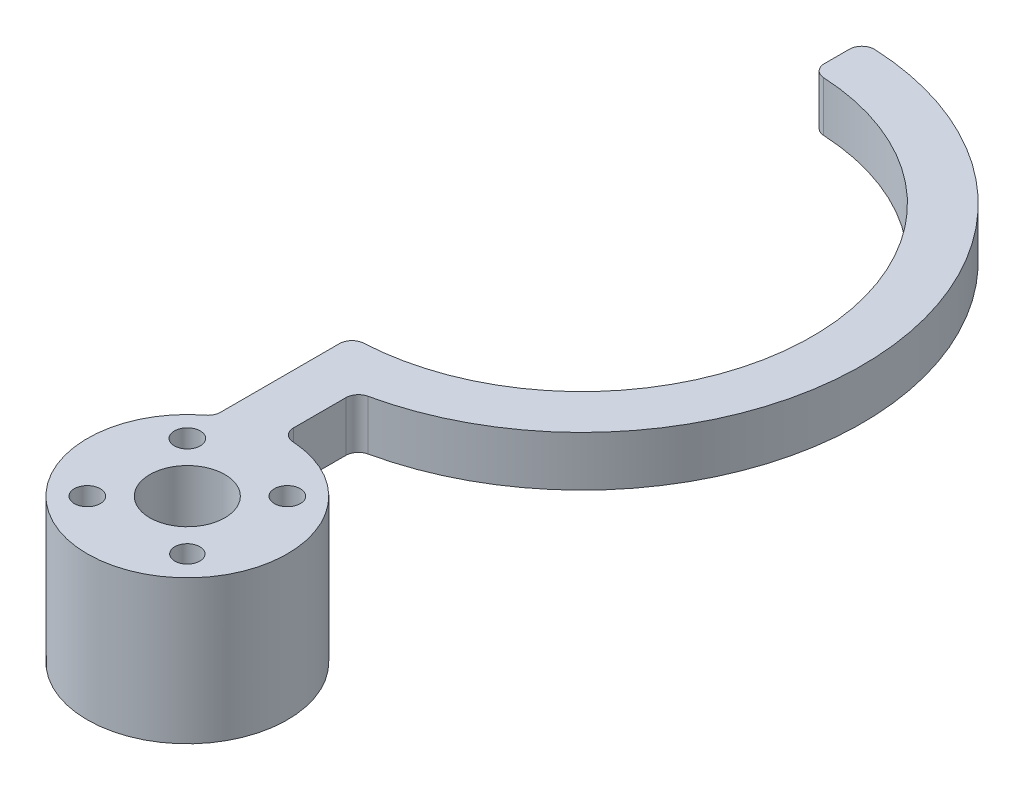
ISO-10303-21;
HEADER;
FILE_DESCRIPTION(('STEP AP214'),'2;1');
FILE_NAME('part.step','',(''),(''),'','','');
FILE_SCHEMA(('AUTOMOTIVE_DESIGN { 1 0 10303 214 1 1 1 1 }'));
ENDSEC;
DATA;
#1=APPLICATION_CONTEXT('core data for automotive mechanical design processes');
#2=APPLICATION_PROTOCOL_DEFINITION('international standard','automotive_design',2000,#1);
#3=PRODUCT_CONTEXT('',#1,'mechanical');
#4=PRODUCT('Part','Part','',(#3));
#5=PRODUCT_RELATED_PRODUCT_CATEGORY('part','',(#4));
#6=PRODUCT_DEFINITION_FORMATION('','',#4);
#7=PRODUCT_DEFINITION_CONTEXT('part definition',#1,'design');
#8=PRODUCT_DEFINITION('design','',#6,#7);
#9=PRODUCT_DEFINITION_SHAPE('','',#8);
#10=(LENGTH_UNIT() NAMED_UNIT(*) SI_UNIT(.MILLI.,.METRE.));
#11=(NAMED_UNIT(*) PLANE_ANGLE_UNIT() SI_UNIT($,.RADIAN.));
#12=(NAMED_UNIT(*) SI_UNIT($,.STERADIAN.) SOLID_ANGLE_UNIT());
#13=UNCERTAINTY_MEASURE_WITH_UNIT(LENGTH_MEASURE(1.E-05),#10,'distance_accuracy_value','');
#14=(GEOMETRIC_REPRESENTATION_CONTEXT(3) GLOBAL_UNCERTAINTY_ASSIGNED_CONTEXT((#13)) GLOBAL_UNIT_ASSIGNED_CONTEXT((#10,
#11,#12)) REPRESENTATION_CONTEXT('',''));
#15=CARTESIAN_POINT('',(0.,0.,0.));
#16=DIRECTION('',(0.,0.,1.));
#17=DIRECTION('',(1.,0.,0.));
#18=AXIS2_PLACEMENT_3D('',#15,#16,#17);
#19=CARTESIAN_POINT('',(8.96696536966746,8.,72.0811709693591));
#20=DIRECTION('',(0.,-1.,0.));
#21=DIRECTION('',(0.,0.,-1.));
#22=AXIS2_PLACEMENT_3D('',#19,#20,#21);
#23=CYLINDRICAL_SURFACE('',#22,16.);
#24=DIRECTION('',(0.,-1.,0.));
#25=VECTOR('',#24,1.);
#26=CARTESIAN_POINT('',(-0.781448292259167,8.,59.3938374797734));
#27=LINE('',#26,#25);
#28=CARTESIAN_POINT('',(-0.781448292259167,8.,59.3938374797734));
#29=VERTEX_POINT('',#28);
#30=CARTESIAN_POINT('',(-0.781448292259168,0.,59.3938374797734));
#31=VERTEX_POINT('',#30);
#32=EDGE_CURVE('E144',#29,#31,#27,.T.);
#33=ORIENTED_EDGE('',*,*,#32,.T.);
#34=CARTESIAN_POINT('',(8.96696536966746,0.,72.0811709693591));
#35=DIRECTION('',(0.,1.,0.));
#36=DIRECTION('',(0.,0.,1.));
#37=AXIS2_PLACEMENT_3D('',#34,#35,#36);
#38=CIRCLE('',#37,16.);
#39=CARTESIAN_POINT('',(9.8852183744075,0.,56.1075423453023));
#40=VERTEX_POINT('',#39);
#41=EDGE_CURVE('E126',#40,#31,#38,.T.);
#42=ORIENTED_EDGE('',*,*,#41,.F.);
#43=DIRECTION('',(0.,-1.,0.));
#44=VECTOR('',#43,1.);
#45=CARTESIAN_POINT('',(9.8852183744075,8.,56.1075423453023));
#46=LINE('',#45,#44);
#47=CARTESIAN_POINT('',(9.8852183744075,8.,56.1075423453023));
#48=VERTEX_POINT('',#47);
#49=EDGE_CURVE('E151',#40,#48,#46,.F.);
#50=ORIENTED_EDGE('',*,*,#49,.T.);
#51=CARTESIAN_POINT('',(8.96696536966746,8.,72.0811709693591));
#52=DIRECTION('',(0.,1.,0.));
#53=DIRECTION('',(0.,0.,1.));
#54=AXIS2_PLACEMENT_3D('',#51,#52,#53);
#55=CIRCLE('',#54,16.);
#56=EDGE_CURVE('E150',#29,#48,#55,.T.);
#57=ORIENTED_EDGE('',*,*,#56,.F.);
#58=EDGE_LOOP('',(#33,#42,#50,#57));
#59=FACE_BOUND('',#58,.T.);
#60=CARTESIAN_POINT('',(8.96696536966746,-15.,72.0811709693591));
#61=DIRECTION('',(0.,1.,0.));
#62=DIRECTION('',(0.,0.,1.));
#63=AXIS2_PLACEMENT_3D('',#60,#61,#62);
#64=CIRCLE('',#63,16.);
#65=CARTESIAN_POINT('',(8.96696536966746,-15.,88.0811709693591));
#66=VERTEX_POINT('',#65);
#67=EDGE_CURVE('E137',#66,#66,#64,.T.);
#68=ORIENTED_EDGE('',*,*,#67,.T.);
#69=EDGE_LOOP('',(#68));
#70=FACE_BOUND('',#69,.T.);
#71=ADVANCED_FACE('F37',(#59,#70),#23,.T.);
#72=CARTESIAN_POINT('',(8.00000000000002,8.,0.));
#73=DIRECTION('',(1.,0.,0.));
#74=DIRECTION('',(0.,0.,-1.));
#75=AXIS2_PLACEMENT_3D('',#72,#73,#74);
#76=PLANE('',#75);
#77=DIRECTION('',(0.,0.,1.));
#78=VECTOR('',#77,1.);
#79=CARTESIAN_POINT('',(8.00000000000002,8.,0.));
#80=LINE('',#79,#78);
#81=CARTESIAN_POINT('',(8.,8.,45.7498513658788));
#82=VERTEX_POINT('',#81);
#83=CARTESIAN_POINT('',(8.,8.,54.1108387672952));
#84=VERTEX_POINT('',#83);
#85=EDGE_CURVE('E201',#82,#84,#80,.T.);
#86=ORIENTED_EDGE('',*,*,#85,.T.);
#87=DIRECTION('',(0.,-1.,0.));
#88=VECTOR('',#87,1.);
#89=CARTESIAN_POINT('',(8.,8.,54.1108387672952));
#90=LINE('',#89,#88);
#91=CARTESIAN_POINT('',(8.,0.,54.1108387672952));
#92=VERTEX_POINT('',#91);
#93=EDGE_CURVE('E152',#84,#92,#90,.T.);
#94=ORIENTED_EDGE('',*,*,#93,.T.);
#95=DIRECTION('',(0.,0.,1.));
#96=VECTOR('',#95,1.);
#97=CARTESIAN_POINT('',(8.00000000000002,0.,0.));
#98=LINE('',#97,#96);
#99=CARTESIAN_POINT('',(8.,0.,45.7498513658788));
#100=VERTEX_POINT('',#99);
#101=EDGE_CURVE('E136',#100,#92,#98,.T.);
#102=ORIENTED_EDGE('',*,*,#101,.F.);
#103=DIRECTION('',(0.,-1.,0.));
#104=VECTOR('',#103,1.);
#105=CARTESIAN_POINT('',(8.,8.,45.7498513658788));
#106=LINE('',#105,#104);
#107=EDGE_CURVE('E157',#100,#82,#106,.F.);
#108=ORIENTED_EDGE('',*,*,#107,.T.);
#109=EDGE_LOOP('',(#86,#94,#102,#108));
#110=FACE_BOUND('',#109,.T.);
#111=ADVANCED_FACE('F216',(#110),#76,.T.);
#112=CARTESIAN_POINT('',(0.,8.,0.));
#113=DIRECTION('',(0.,-1.,0.));
#114=DIRECTION('',(0.,0.,-1.));
#115=AXIS2_PLACEMENT_3D('',#112,#113,#114);
#116=CYLINDRICAL_SURFACE('',#115,44.83);
#117=CARTESIAN_POINT('',(0.,8.,0.));
#118=DIRECTION('',(0.,1.,0.));
#119=DIRECTION('',(0.,0.,1.));
#120=AXIS2_PLACEMENT_3D('',#117,#118,#119);
#121=CIRCLE('',#120,44.83);
#122=CARTESIAN_POINT('',(9.57292333973949,8.,43.7959819930033));
#123=VERTEX_POINT('',#122);
#124=CARTESIAN_POINT('',(2.09339248190515,8.,-44.7810965466089));
#125=VERTEX_POINT('',#124);
#126=EDGE_CURVE('E199',#123,#125,#121,.T.);
#127=ORIENTED_EDGE('',*,*,#126,.F.);
#128=DIRECTION('',(0.,-1.,0.));
#129=VECTOR('',#128,1.);
#130=CARTESIAN_POINT('',(9.57292333973949,8.,43.7959819930033));
#131=LINE('',#130,#129);
#132=CARTESIAN_POINT('',(9.57292333973949,0.,43.7959819930033));
#133=VERTEX_POINT('',#132);
#134=EDGE_CURVE('E162',#123,#133,#131,.T.);
#135=ORIENTED_EDGE('',*,*,#134,.T.);
#136=CARTESIAN_POINT('',(0.,0.,0.));
#137=DIRECTION('',(0.,1.,0.));
#138=DIRECTION('',(0.,0.,1.));
#139=AXIS2_PLACEMENT_3D('',#136,#137,#138);
#140=CIRCLE('',#139,44.83);
#141=CARTESIAN_POINT('',(2.09339248190515,0.,-44.7810965466089));
#142=VERTEX_POINT('',#141);
#143=EDGE_CURVE('E214',#133,#142,#140,.T.);
#144=ORIENTED_EDGE('',*,*,#143,.T.);
#145=DIRECTION('',(0.,-1.,0.));
#146=VECTOR('',#145,1.);
#147=CARTESIAN_POINT('',(2.09339248190515,8.,-44.7810965466089));
#148=LINE('',#147,#146);
#149=EDGE_CURVE('E154',#142,#125,#148,.F.);
#150=ORIENTED_EDGE('',*,*,#149,.T.);
#151=EDGE_LOOP('',(#127,#135,#144,#150));
#152=FACE_BOUND('',#151,.T.);
#153=ADVANCED_FACE('F206',(#152),#116,.T.);
#154=CARTESIAN_POINT('',(0.,8.,0.));
#155=DIRECTION('',(1.,0.,0.));
#156=DIRECTION('',(0.,0.,-1.));
#157=AXIS2_PLACEMENT_3D('',#154,#155,#156);
#158=PLANE('',#157);
#159=DIRECTION('',(0.,0.,1.));
#160=VECTOR('',#159,1.);
#161=CARTESIAN_POINT('',(0.,0.,0.));
#162=LINE('',#161,#160);
#163=CARTESIAN_POINT('',(0.,0.,-42.7832782755132));
#164=VERTEX_POINT('',#163);
#165=CARTESIAN_POINT('',(0.,0.,-38.7784592267408));
#166=VERTEX_POINT('',#165);
#167=EDGE_CURVE('E219',#164,#166,#162,.T.);
#168=ORIENTED_EDGE('',*,*,#167,.T.);
#169=DIRECTION('',(0.,1.,0.));
#170=VECTOR('',#169,1.);
#171=CARTESIAN_POINT('',(0.,8.,-38.7784592267408));
#172=LINE('',#171,#170);
#173=CARTESIAN_POINT('',(0.,8.,-38.7784592267408));
#174=VERTEX_POINT('',#173);
#175=EDGE_CURVE('E52',#166,#174,#172,.T.);
#176=ORIENTED_EDGE('',*,*,#175,.T.);
#177=DIRECTION('',(0.,0.,1.));
#178=VECTOR('',#177,1.);
#179=CARTESIAN_POINT('',(0.,8.,0.));
#180=LINE('',#179,#178);
#181=CARTESIAN_POINT('',(0.,8.,-42.7832782755132));
#182=VERTEX_POINT('',#181);
#183=EDGE_CURVE('E210',#182,#174,#180,.T.);
#184=ORIENTED_EDGE('',*,*,#183,.F.);
#185=DIRECTION('',(0.,-1.,0.));
#186=VECTOR('',#185,1.);
#187=CARTESIAN_POINT('',(0.,8.,-42.7832782755132));
#188=LINE('',#187,#186);
#189=EDGE_CURVE('E185',#182,#164,#188,.T.);
#190=ORIENTED_EDGE('',*,*,#189,.T.);
#191=EDGE_LOOP('',(#168,#176,#184,#190));
#192=FACE_BOUND('',#191,.T.);
#193=ADVANCED_FACE('F291',(#192),#158,.F.);
#194=CARTESIAN_POINT('',(0.,8.,0.));
#195=DIRECTION('',(0.,-1.,0.));
#196=DIRECTION('',(0.,0.,-1.));
#197=AXIS2_PLACEMENT_3D('',#194,#195,#196);
#198=CYLINDRICAL_SURFACE('',#197,36.83);
#199=CARTESIAN_POINT('',(0.,0.,0.));
#200=DIRECTION('',(0.,1.,0.));
#201=DIRECTION('',(0.,0.,1.));
#202=AXIS2_PLACEMENT_3D('',#199,#200,#201);
#203=CIRCLE('',#202,36.83);
#204=CARTESIAN_POINT('',(1.8969868658254,0.,36.7811139150364));
#205=VERTEX_POINT('',#204);
#206=CARTESIAN_POINT('',(1.89698686582535,0.,-36.7811139150364));
#207=VERTEX_POINT('',#206);
#208=EDGE_CURVE('E226',#205,#207,#203,.T.);
#209=ORIENTED_EDGE('',*,*,#208,.F.);
#210=DIRECTION('',(0.,-1.,0.));
#211=VECTOR('',#210,1.);
#212=CARTESIAN_POINT('',(1.8969868658254,8.,36.7811139150364));
#213=LINE('',#212,#211);
#214=CARTESIAN_POINT('',(1.8969868658254,8.,36.7811139150364));
#215=VERTEX_POINT('',#214);
#216=EDGE_CURVE('E178',#205,#215,#213,.F.);
#217=ORIENTED_EDGE('',*,*,#216,.T.);
#218=CARTESIAN_POINT('',(0.,8.,0.));
#219=DIRECTION('',(0.,1.,0.));
#220=DIRECTION('',(0.,0.,1.));
#221=AXIS2_PLACEMENT_3D('',#218,#219,#220);
#222=CIRCLE('',#221,36.83);
#223=CARTESIAN_POINT('',(1.89698686582535,8.,-36.7811139150364));
#224=VERTEX_POINT('',#223);
#225=EDGE_CURVE('E232',#215,#224,#222,.T.);
#226=ORIENTED_EDGE('',*,*,#225,.T.);
#227=DIRECTION('',(0.,-1.,0.));
#228=VECTOR('',#227,1.);
#229=CARTESIAN_POINT('',(1.89698686582535,8.,-36.7811139150364));
#230=LINE('',#229,#228);
#231=EDGE_CURVE('E175',#224,#207,#230,.T.);
#232=ORIENTED_EDGE('',*,*,#231,.T.);
#233=EDGE_LOOP('',(#209,#217,#226,#232));
#234=FACE_BOUND('',#233,.T.);
#235=ADVANCED_FACE('F280',(#234),#198,.F.);
#236=CARTESIAN_POINT('',(0.966965369667458,8.,80.0811709693591));
#237=DIRECTION('',(0.,-1.,0.));
#238=DIRECTION('',(0.,0.,-1.));
#239=AXIS2_PLACEMENT_3D('',#236,#237,#238);
#240=CYLINDRICAL_SURFACE('',#239,2.07500000000001);
#241=CARTESIAN_POINT('',(0.966965369667458,8.,80.0811709693591));
#242=DIRECTION('',(0.,1.,0.));
#243=DIRECTION('',(0.,0.,1.));
#244=AXIS2_PLACEMENT_3D('',#241,#242,#243);
#245=CIRCLE('',#244,2.07500000000001);
#246=CARTESIAN_POINT('',(0.966965369667458,8.,82.1561709693591));
#247=VERTEX_POINT('',#246);
#248=EDGE_CURVE('E242',#247,#247,#245,.T.);
#249=ORIENTED_EDGE('',*,*,#248,.T.);
#250=EDGE_LOOP('',(#249));
#251=FACE_BOUND('',#250,.T.);
#252=CARTESIAN_POINT('',(0.966965369667458,-15.,80.0811709693591));
#253=DIRECTION('',(0.,1.,0.));
#254=DIRECTION('',(0.,0.,1.));
#255=AXIS2_PLACEMENT_3D('',#252,#253,#254);
#256=CIRCLE('',#255,2.07500000000001);
#257=CARTESIAN_POINT('',(0.966965369667458,-15.,82.1561709693591));
#258=VERTEX_POINT('',#257);
#259=EDGE_CURVE('E270',#258,#258,#256,.T.);
#260=ORIENTED_EDGE('',*,*,#259,.F.);
#261=EDGE_LOOP('',(#260));
#262=FACE_BOUND('',#261,.T.);
#263=ADVANCED_FACE('F277',(#251,#262),#240,.F.);
#264=CARTESIAN_POINT('',(16.9669653696675,8.,64.0811709693591));
#265=DIRECTION('',(0.,-1.,0.));
#266=DIRECTION('',(0.,0.,-1.));
#267=AXIS2_PLACEMENT_3D('',#264,#265,#266);
#268=CYLINDRICAL_SURFACE('',#267,2.075);
#269=CARTESIAN_POINT('',(16.9669653696675,8.,64.0811709693591));
#270=DIRECTION('',(0.,1.,0.));
#271=DIRECTION('',(0.,0.,1.));
#272=AXIS2_PLACEMENT_3D('',#269,#270,#271);
#273=CIRCLE('',#272,2.075);
#274=CARTESIAN_POINT('',(16.9669653696675,8.,66.1561709693591));
#275=VERTEX_POINT('',#274);
#276=EDGE_CURVE('E245',#275,#275,#273,.T.);
#277=ORIENTED_EDGE('',*,*,#276,.T.);
#278=EDGE_LOOP('',(#277));
#279=FACE_BOUND('',#278,.T.);
#280=CARTESIAN_POINT('',(16.9669653696675,-15.,64.0811709693591));
#281=DIRECTION('',(0.,1.,0.));
#282=DIRECTION('',(0.,0.,1.));
#283=AXIS2_PLACEMENT_3D('',#280,#281,#282);
#284=CIRCLE('',#283,2.07499999999999);
#285=CARTESIAN_POINT('',(16.9669653696675,-15.,66.1561709693591));
#286=VERTEX_POINT('',#285);
#287=EDGE_CURVE('E262',#286,#286,#284,.T.);
#288=ORIENTED_EDGE('',*,*,#287,.F.);
#289=EDGE_LOOP('',(#288));
#290=FACE_BOUND('',#289,.T.);
#291=ADVANCED_FACE('F279',(#279,#290),#268,.F.);
#292=CARTESIAN_POINT('',(0.966965369667458,8.,64.0811709693591));
#293=DIRECTION('',(0.,-1.,0.));
#294=DIRECTION('',(0.,0.,-1.));
#295=AXIS2_PLACEMENT_3D('',#292,#293,#294);
#296=CYLINDRICAL_SURFACE('',#295,2.07500000000001);
#297=CARTESIAN_POINT('',(0.966965369667458,8.,64.0811709693591));
#298=DIRECTION('',(0.,1.,0.));
#299=DIRECTION('',(0.,0.,1.));
#300=AXIS2_PLACEMENT_3D('',#297,#298,#299);
#301=CIRCLE('',#300,2.07500000000001);
#302=CARTESIAN_POINT('',(0.966965369667458,8.,66.1561709693591));
#303=VERTEX_POINT('',#302);
#304=EDGE_CURVE('E248',#303,#303,#301,.T.);
#305=ORIENTED_EDGE('',*,*,#304,.T.);
#306=EDGE_LOOP('',(#305));
#307=FACE_BOUND('',#306,.T.);
#308=CARTESIAN_POINT('',(0.966965369667458,-15.,64.0811709693591));
#309=DIRECTION('',(0.,1.,0.));
#310=DIRECTION('',(0.,0.,1.));
#311=AXIS2_PLACEMENT_3D('',#308,#309,#310);
#312=CIRCLE('',#311,2.07500000000001);
#313=CARTESIAN_POINT('',(0.966965369667458,-15.,66.1561709693591));
#314=VERTEX_POINT('',#313);
#315=EDGE_CURVE('E267',#314,#314,#312,.T.);
#316=ORIENTED_EDGE('',*,*,#315,.F.);
#317=EDGE_LOOP('',(#316));
#318=FACE_BOUND('',#317,.T.);
#319=ADVANCED_FACE('F287',(#307,#318),#296,.F.);
#320=CARTESIAN_POINT('',(8.96696536966746,8.,72.0811709693591));
#321=DIRECTION('',(0.,-1.,0.));
#322=DIRECTION('',(0.,0.,-1.));
#323=AXIS2_PLACEMENT_3D('',#320,#321,#322);
#324=CYLINDRICAL_SURFACE('',#323,6.00320826308857);
#325=CARTESIAN_POINT('',(8.96696536966746,8.,72.0811709693591));
#326=DIRECTION('',(0.,1.,0.));
#327=DIRECTION('',(0.,0.,1.));
#328=AXIS2_PLACEMENT_3D('',#325,#326,#327);
#329=CIRCLE('',#328,6.00320826308857);
#330=CARTESIAN_POINT('',(8.96696536966746,8.,78.0843792324477));
#331=VERTEX_POINT('',#330);
#332=EDGE_CURVE('E230',#331,#331,#329,.T.);
#333=ORIENTED_EDGE('',*,*,#332,.T.);
#334=EDGE_LOOP('',(#333));
#335=FACE_BOUND('',#334,.T.);
#336=CARTESIAN_POINT('',(8.96696536966746,-15.,72.0811709693591));
#337=DIRECTION('',(0.,1.,0.));
#338=DIRECTION('',(0.,0.,1.));
#339=AXIS2_PLACEMENT_3D('',#336,#337,#338);
#340=CIRCLE('',#339,6.00320826308856);
#341=CARTESIAN_POINT('',(8.96696536966746,-15.,78.0843792324477));
#342=VERTEX_POINT('',#341);
#343=EDGE_CURVE('E255',#342,#342,#340,.T.);
#344=ORIENTED_EDGE('',*,*,#343,.F.);
#345=EDGE_LOOP('',(#344));
#346=FACE_BOUND('',#345,.T.);
#347=ADVANCED_FACE('F307',(#335,#346),#324,.F.);
#348=CARTESIAN_POINT('',(0.,8.,0.));
#349=DIRECTION('',(1.,0.,0.));
#350=DIRECTION('',(0.,0.,-1.));
#351=AXIS2_PLACEMENT_3D('',#348,#349,#350);
#352=PLANE('',#351);
#353=DIRECTION('',(0.,0.,1.));
#354=VECTOR('',#353,1.);
#355=CARTESIAN_POINT('',(0.,0.,0.));
#356=LINE('',#355,#354);
#357=CARTESIAN_POINT('',(0.,0.,38.7784592267408));
#358=VERTEX_POINT('',#357);
#359=CARTESIAN_POINT('',(0.,0.,57.8079207935752));
#360=VERTEX_POINT('',#359);
#361=EDGE_CURVE('E229',#358,#360,#356,.T.);
#362=ORIENTED_EDGE('',*,*,#361,.T.);
#363=DIRECTION('',(0.,1.,0.));
#364=VECTOR('',#363,1.);
#365=CARTESIAN_POINT('',(0.,8.,57.8079207935752));
#366=LINE('',#365,#364);
#367=CARTESIAN_POINT('',(0.,8.,57.8079207935752));
#368=VERTEX_POINT('',#367);
#369=EDGE_CURVE('E145',#360,#368,#366,.T.);
#370=ORIENTED_EDGE('',*,*,#369,.T.);
#371=DIRECTION('',(0.,0.,1.));
#372=VECTOR('',#371,1.);
#373=CARTESIAN_POINT('',(0.,8.,0.));
#374=LINE('',#373,#372);
#375=CARTESIAN_POINT('',(0.,8.,38.7784592267408));
#376=VERTEX_POINT('',#375);
#377=EDGE_CURVE('E222',#376,#368,#374,.T.);
#378=ORIENTED_EDGE('',*,*,#377,.F.);
#379=DIRECTION('',(0.,1.,0.));
#380=VECTOR('',#379,1.);
#381=CARTESIAN_POINT('',(0.,0.,38.7784592267408));
#382=LINE('',#381,#380);
#383=EDGE_CURVE('E165',#376,#358,#382,.F.);
#384=ORIENTED_EDGE('',*,*,#383,.T.);
#385=EDGE_LOOP('',(#362,#370,#378,#384));
#386=FACE_BOUND('',#385,.T.);
#387=ADVANCED_FACE('F304',(#386),#352,.F.);
#388=CARTESIAN_POINT('',(0.,8.,0.));
#389=DIRECTION('',(0.,1.,0.));
#390=DIRECTION('',(0.,0.,1.));
#391=AXIS2_PLACEMENT_3D('',#388,#389,#390);
#392=PLANE('',#391);
#393=CARTESIAN_POINT('',(-1.99999999999999,8.,57.8079207935752));
#394=DIRECTION('',(0.,1.,0.));
#395=DIRECTION('',(0.,0.,1.));
#396=AXIS2_PLACEMENT_3D('',#393,#394,#395);
#397=CIRCLE('',#396,2.);
#398=EDGE_CURVE('E11',#368,#29,#397,.F.);
#399=ORIENTED_EDGE('',*,*,#398,.T.);
#400=ORIENTED_EDGE('',*,*,#56,.T.);
#401=CARTESIAN_POINT('',(10.,8.,54.1108387672952));
#402=DIRECTION('',(0.,1.,0.));
#403=DIRECTION('',(0.,0.,1.));
#404=AXIS2_PLACEMENT_3D('',#401,#402,#403);
#405=CIRCLE('',#404,2.);
#406=EDGE_CURVE('E190',#48,#84,#405,.F.);
#407=ORIENTED_EDGE('',*,*,#406,.T.);
#408=ORIENTED_EDGE('',*,*,#85,.F.);
#409=CARTESIAN_POINT('',(10.,8.,45.7498513658788));
#410=DIRECTION('',(0.,1.,0.));
#411=DIRECTION('',(0.,0.,1.));
#412=AXIS2_PLACEMENT_3D('',#409,#410,#411);
#413=CIRCLE('',#412,2.);
#414=EDGE_CURVE('E146',#82,#123,#413,.F.);
#415=ORIENTED_EDGE('',*,*,#414,.T.);
#416=ORIENTED_EDGE('',*,*,#126,.T.);
#417=CARTESIAN_POINT('',(1.99999999999995,8.,-42.7832782755132));
#418=DIRECTION('',(0.,1.,0.));
#419=DIRECTION('',(0.,0.,1.));
#420=AXIS2_PLACEMENT_3D('',#417,#418,#419);
#421=CIRCLE('',#420,2.);
#422=EDGE_CURVE('E59',#125,#182,#421,.T.);
#423=ORIENTED_EDGE('',*,*,#422,.T.);
#424=ORIENTED_EDGE('',*,*,#183,.T.);
#425=CARTESIAN_POINT('',(1.99999999999995,8.,-38.7784592267408));
#426=DIRECTION('',(0.,1.,0.));
#427=DIRECTION('',(0.,0.,1.));
#428=AXIS2_PLACEMENT_3D('',#425,#426,#427);
#429=CIRCLE('',#428,2.);
#430=EDGE_CURVE('E181',#174,#224,#429,.T.);
#431=ORIENTED_EDGE('',*,*,#430,.T.);
#432=ORIENTED_EDGE('',*,*,#225,.F.);
#433=CARTESIAN_POINT('',(2.,8.,38.7784592267408));
#434=DIRECTION('',(0.,1.,0.));
#435=DIRECTION('',(0.,0.,1.));
#436=AXIS2_PLACEMENT_3D('',#433,#434,#435);
#437=CIRCLE('',#436,2.);
#438=EDGE_CURVE('E183',#215,#376,#437,.T.);
#439=ORIENTED_EDGE('',*,*,#438,.T.);
#440=ORIENTED_EDGE('',*,*,#377,.T.);
#441=EDGE_LOOP('',(#399,#400,#407,#408,#415,#416,#423,#424,#431,#432,#439,#440));
#442=FACE_BOUND('',#441,.T.);
#443=ORIENTED_EDGE('',*,*,#332,.F.);
#444=EDGE_LOOP('',(#443));
#445=FACE_BOUND('',#444,.T.);
#446=ORIENTED_EDGE('',*,*,#304,.F.);
#447=EDGE_LOOP('',(#446));
#448=FACE_BOUND('',#447,.T.);
#449=ORIENTED_EDGE('',*,*,#276,.F.);
#450=EDGE_LOOP('',(#449));
#451=FACE_BOUND('',#450,.T.);
#452=ORIENTED_EDGE('',*,*,#248,.F.);
#453=EDGE_LOOP('',(#452));
#454=FACE_BOUND('',#453,.T.);
#455=CARTESIAN_POINT('',(16.9669653696675,8.,80.0811709693591));
#456=DIRECTION('',(0.,1.,0.));
#457=DIRECTION('',(0.,0.,1.));
#458=AXIS2_PLACEMENT_3D('',#455,#456,#457);
#459=CIRCLE('',#458,2.0015347354623);
#460=CARTESIAN_POINT('',(16.9669653696675,8.,82.0827057048214));
#461=VERTEX_POINT('',#460);
#462=EDGE_CURVE('E259',#461,#461,#459,.T.);
#463=ORIENTED_EDGE('',*,*,#462,.F.);
#464=EDGE_LOOP('',(#463));
#465=FACE_BOUND('',#464,.T.);
#466=ADVANCED_FACE('F197',(#442,#445,#448,#451,#454,#465),#392,.T.);
#467=CARTESIAN_POINT('',(0.,0.,0.));
#468=DIRECTION('',(0.,1.,0.));
#469=DIRECTION('',(0.,0.,1.));
#470=AXIS2_PLACEMENT_3D('',#467,#468,#469);
#471=PLANE('',#470);
#472=CARTESIAN_POINT('',(10.,0.,54.1108387672952));
#473=DIRECTION('',(0.,1.,0.));
#474=DIRECTION('',(0.,0.,1.));
#475=AXIS2_PLACEMENT_3D('',#472,#473,#474);
#476=CIRCLE('',#475,2.);
#477=EDGE_CURVE('E132',#92,#40,#476,.T.);
#478=ORIENTED_EDGE('',*,*,#477,.T.);
#479=ORIENTED_EDGE('',*,*,#41,.T.);
#480=CARTESIAN_POINT('',(-1.99999999999999,0.,57.8079207935752));
#481=DIRECTION('',(0.,1.,0.));
#482=DIRECTION('',(0.,0.,1.));
#483=AXIS2_PLACEMENT_3D('',#480,#481,#482);
#484=CIRCLE('',#483,2.);
#485=EDGE_CURVE('E45',#31,#360,#484,.T.);
#486=ORIENTED_EDGE('',*,*,#485,.T.);
#487=ORIENTED_EDGE('',*,*,#361,.F.);
#488=CARTESIAN_POINT('',(2.,0.,38.7784592267408));
#489=DIRECTION('',(0.,1.,0.));
#490=DIRECTION('',(0.,0.,1.));
#491=AXIS2_PLACEMENT_3D('',#488,#489,#490);
#492=CIRCLE('',#491,2.);
#493=EDGE_CURVE('E173',#358,#205,#492,.F.);
#494=ORIENTED_EDGE('',*,*,#493,.T.);
#495=ORIENTED_EDGE('',*,*,#208,.T.);
#496=CARTESIAN_POINT('',(1.99999999999995,0.,-38.7784592267408));
#497=DIRECTION('',(0.,1.,0.));
#498=DIRECTION('',(0.,0.,1.));
#499=AXIS2_PLACEMENT_3D('',#496,#497,#498);
#500=CIRCLE('',#499,2.);
#501=EDGE_CURVE('E171',#207,#166,#500,.F.);
#502=ORIENTED_EDGE('',*,*,#501,.T.);
#503=ORIENTED_EDGE('',*,*,#167,.F.);
#504=CARTESIAN_POINT('',(1.99999999999995,0.,-42.7832782755132));
#505=DIRECTION('',(0.,1.,0.));
#506=DIRECTION('',(0.,0.,1.));
#507=AXIS2_PLACEMENT_3D('',#504,#505,#506);
#508=CIRCLE('',#507,2.);
#509=EDGE_CURVE('E169',#164,#142,#508,.F.);
#510=ORIENTED_EDGE('',*,*,#509,.T.);
#511=ORIENTED_EDGE('',*,*,#143,.F.);
#512=CARTESIAN_POINT('',(10.,0.,45.7498513658788));
#513=DIRECTION('',(0.,1.,0.));
#514=DIRECTION('',(0.,0.,1.));
#515=AXIS2_PLACEMENT_3D('',#512,#513,#514);
#516=CIRCLE('',#515,2.);
#517=EDGE_CURVE('E192',#133,#100,#516,.T.);
#518=ORIENTED_EDGE('',*,*,#517,.T.);
#519=ORIENTED_EDGE('',*,*,#101,.T.);
#520=EDGE_LOOP('',(#478,#479,#486,#487,#494,#495,#502,#503,#510,#511,#518,#519));
#521=FACE_BOUND('',#520,.T.);
#522=ADVANCED_FACE('F128',(#521),#471,.F.);
#523=CARTESIAN_POINT('',(10.,8.,54.1108387672952));
#524=DIRECTION('',(0.,-1.,0.));
#525=DIRECTION('',(0.,0.,-1.));
#526=AXIS2_PLACEMENT_3D('',#523,#524,#525);
#527=CYLINDRICAL_SURFACE('',#526,2.);
#528=ORIENTED_EDGE('',*,*,#406,.F.);
#529=ORIENTED_EDGE('',*,*,#49,.F.);
#530=ORIENTED_EDGE('',*,*,#477,.F.);
#531=ORIENTED_EDGE('',*,*,#93,.F.);
#532=EDGE_LOOP('',(#528,#529,#530,#531));
#533=FACE_BOUND('',#532,.T.);
#534=ADVANCED_FACE('F311',(#533),#527,.F.);
#535=CARTESIAN_POINT('',(10.,8.,45.7498513658788));
#536=DIRECTION('',(0.,-1.,0.));
#537=DIRECTION('',(0.,0.,-1.));
#538=AXIS2_PLACEMENT_3D('',#535,#536,#537);
#539=CYLINDRICAL_SURFACE('',#538,2.);
#540=ORIENTED_EDGE('',*,*,#414,.F.);
#541=ORIENTED_EDGE('',*,*,#107,.F.);
#542=ORIENTED_EDGE('',*,*,#517,.F.);
#543=ORIENTED_EDGE('',*,*,#134,.F.);
#544=EDGE_LOOP('',(#540,#541,#542,#543));
#545=FACE_BOUND('',#544,.T.);
#546=ADVANCED_FACE('F212',(#545),#539,.F.);
#547=CARTESIAN_POINT('',(-1.99999999999999,8.,57.8079207935752));
#548=DIRECTION('',(0.,-1.,0.));
#549=DIRECTION('',(0.,0.,-1.));
#550=AXIS2_PLACEMENT_3D('',#547,#548,#549);
#551=CYLINDRICAL_SURFACE('',#550,2.);
#552=ORIENTED_EDGE('',*,*,#398,.F.);
#553=ORIENTED_EDGE('',*,*,#369,.F.);
#554=ORIENTED_EDGE('',*,*,#485,.F.);
#555=ORIENTED_EDGE('',*,*,#32,.F.);
#556=EDGE_LOOP('',(#552,#553,#554,#555));
#557=FACE_BOUND('',#556,.T.);
#558=ADVANCED_FACE('F143',(#557),#551,.F.);
#559=CARTESIAN_POINT('',(2.,8.,38.7784592267408));
#560=DIRECTION('',(0.,-1.,0.));
#561=DIRECTION('',(0.,0.,-1.));
#562=AXIS2_PLACEMENT_3D('',#559,#560,#561);
#563=CYLINDRICAL_SURFACE('',#562,2.);
#564=ORIENTED_EDGE('',*,*,#438,.F.);
#565=ORIENTED_EDGE('',*,*,#216,.F.);
#566=ORIENTED_EDGE('',*,*,#493,.F.);
#567=ORIENTED_EDGE('',*,*,#383,.F.);
#568=EDGE_LOOP('',(#564,#565,#566,#567));
#569=FACE_BOUND('',#568,.T.);
#570=ADVANCED_FACE('F347',(#569),#563,.T.);
#571=CARTESIAN_POINT('',(1.99999999999995,8.,-38.7784592267408));
#572=DIRECTION('',(0.,-1.,0.));
#573=DIRECTION('',(0.,0.,-1.));
#574=AXIS2_PLACEMENT_3D('',#571,#572,#573);
#575=CYLINDRICAL_SURFACE('',#574,2.);
#576=ORIENTED_EDGE('',*,*,#430,.F.);
#577=ORIENTED_EDGE('',*,*,#175,.F.);
#578=ORIENTED_EDGE('',*,*,#501,.F.);
#579=ORIENTED_EDGE('',*,*,#231,.F.);
#580=EDGE_LOOP('',(#576,#577,#578,#579));
#581=FACE_BOUND('',#580,.T.);
#582=ADVANCED_FACE('F349',(#581),#575,.T.);
#583=CARTESIAN_POINT('',(1.99999999999995,8.,-42.7832782755132));
#584=DIRECTION('',(0.,-1.,0.));
#585=DIRECTION('',(0.,0.,-1.));
#586=AXIS2_PLACEMENT_3D('',#583,#584,#585);
#587=CYLINDRICAL_SURFACE('',#586,2.);
#588=ORIENTED_EDGE('',*,*,#422,.F.);
#589=ORIENTED_EDGE('',*,*,#149,.F.);
#590=ORIENTED_EDGE('',*,*,#509,.F.);
#591=ORIENTED_EDGE('',*,*,#189,.F.);
#592=EDGE_LOOP('',(#588,#589,#590,#591));
#593=FACE_BOUND('',#592,.T.);
#594=ADVANCED_FACE('F39',(#593),#587,.T.);
#595=CARTESIAN_POINT('',(8.96696536966746,-15.,72.0811709693591));
#596=DIRECTION('',(0.,1.,0.));
#597=DIRECTION('',(0.,0.,1.));
#598=AXIS2_PLACEMENT_3D('',#595,#596,#597);
#599=PLANE('',#598);
#600=ORIENTED_EDGE('',*,*,#259,.T.);
#601=EDGE_LOOP('',(#600));
#602=FACE_BOUND('',#601,.T.);
#603=ORIENTED_EDGE('',*,*,#315,.T.);
#604=EDGE_LOOP('',(#603));
#605=FACE_BOUND('',#604,.T.);
#606=ORIENTED_EDGE('',*,*,#287,.T.);
#607=EDGE_LOOP('',(#606));
#608=FACE_BOUND('',#607,.T.);
#609=CARTESIAN_POINT('',(16.9669653696675,-15.,80.0811709693591));
#610=DIRECTION('',(0.,1.,0.));
#611=DIRECTION('',(0.,0.,1.));
#612=AXIS2_PLACEMENT_3D('',#609,#610,#611);
#613=CIRCLE('',#612,2.0015347354623);
#614=CARTESIAN_POINT('',(16.9669653696675,-15.,82.0827057048214));
#615=VERTEX_POINT('',#614);
#616=EDGE_CURVE('E258',#615,#615,#613,.T.);
#617=ORIENTED_EDGE('',*,*,#616,.T.);
#618=EDGE_LOOP('',(#617));
#619=FACE_BOUND('',#618,.T.);
#620=ORIENTED_EDGE('',*,*,#343,.T.);
#621=EDGE_LOOP('',(#620));
#622=FACE_BOUND('',#621,.T.);
#623=ORIENTED_EDGE('',*,*,#67,.F.);
#624=EDGE_LOOP('',(#623));
#625=FACE_BOUND('',#624,.T.);
#626=ADVANCED_FACE('F274',(#602,#605,#608,#619,#622,#625),#599,.F.);
#627=CARTESIAN_POINT('',(16.9669653696675,-15.,80.0811709693591));
#628=DIRECTION('',(0.,1.,0.));
#629=DIRECTION('',(0.,0.,1.));
#630=AXIS2_PLACEMENT_3D('',#627,#628,#629);
#631=CYLINDRICAL_SURFACE('',#630,2.0015347354623);
#632=ORIENTED_EDGE('',*,*,#616,.F.);
#633=EDGE_LOOP('',(#632));
#634=FACE_BOUND('',#633,.T.);
#635=ORIENTED_EDGE('',*,*,#462,.T.);
#636=EDGE_LOOP('',(#635));
#637=FACE_BOUND('',#636,.T.);
#638=ADVANCED_FACE('F316',(#634,#637),#631,.F.);
#639=CLOSED_SHELL('',(#71,#111,#153,#193,#235,#263,#291,#319,#347,#387,#466,#522,#534,#546,#558,
#570,#582,#594,#626,#638));
#640=MANIFOLD_SOLID_BREP('B2',#639);
#641=ADVANCED_BREP_SHAPE_REPRESENTATION('',(#18,#640),#14);
#642=SHAPE_DEFINITION_REPRESENTATION(#9,#641);
ENDSEC;
END-ISO-10303-21;
